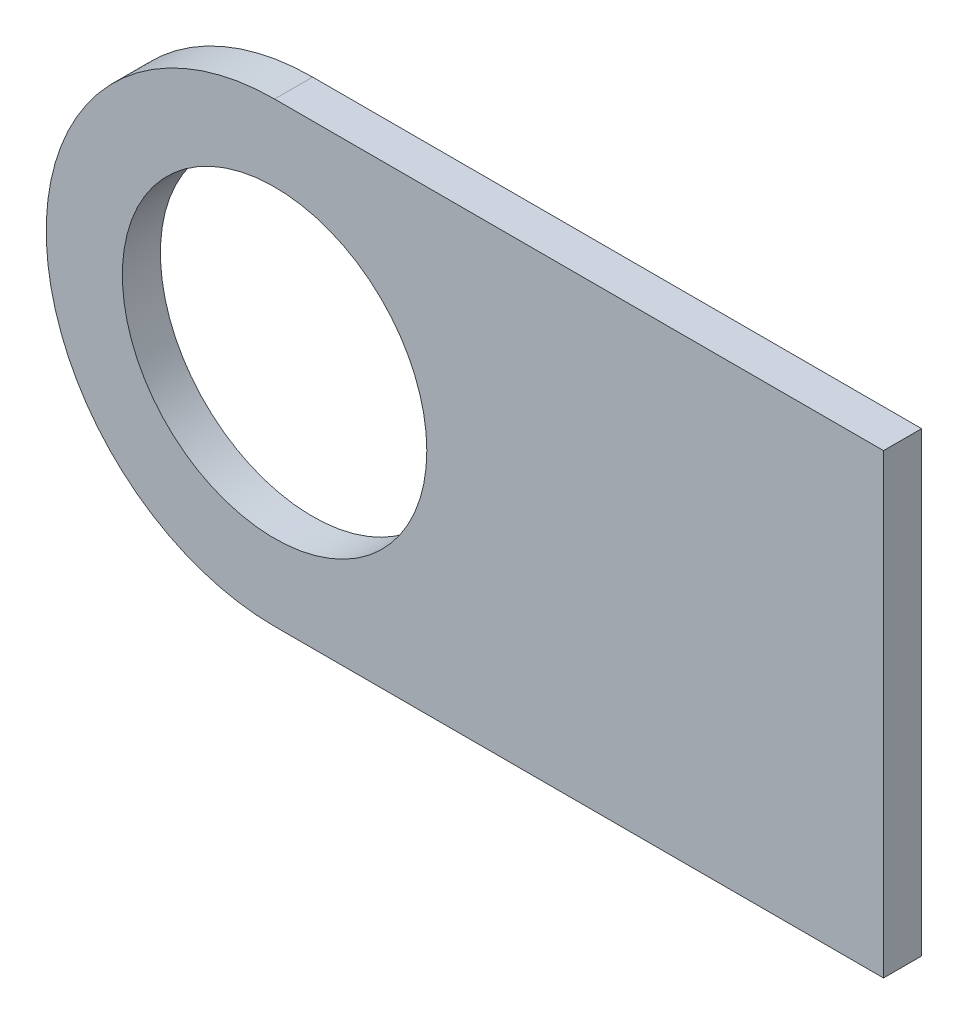
ISO-10303-21;
HEADER;
FILE_DESCRIPTION(('STEP AP214'),'2;1');
FILE_NAME('part.step','',(''),(''),'','','');
FILE_SCHEMA(('AUTOMOTIVE_DESIGN { 1 0 10303 214 1 1 1 1 }'));
ENDSEC;
DATA;
#1=APPLICATION_CONTEXT('core data for automotive mechanical design processes');
#2=APPLICATION_PROTOCOL_DEFINITION('international standard','automotive_design',2000,#1);
#3=PRODUCT_CONTEXT('',#1,'mechanical');
#4=PRODUCT('Part','Part','',(#3));
#5=PRODUCT_RELATED_PRODUCT_CATEGORY('part','',(#4));
#6=PRODUCT_DEFINITION_FORMATION('','',#4);
#7=PRODUCT_DEFINITION_CONTEXT('part definition',#1,'design');
#8=PRODUCT_DEFINITION('design','',#6,#7);
#9=PRODUCT_DEFINITION_SHAPE('','',#8);
#10=(LENGTH_UNIT() NAMED_UNIT(*) SI_UNIT(.MILLI.,.METRE.));
#11=(NAMED_UNIT(*) PLANE_ANGLE_UNIT() SI_UNIT($,.RADIAN.));
#12=(NAMED_UNIT(*) SI_UNIT($,.STERADIAN.) SOLID_ANGLE_UNIT());
#13=UNCERTAINTY_MEASURE_WITH_UNIT(LENGTH_MEASURE(1.E-05),#10,'distance_accuracy_value','');
#14=(GEOMETRIC_REPRESENTATION_CONTEXT(3) GLOBAL_UNCERTAINTY_ASSIGNED_CONTEXT((#13)) GLOBAL_UNIT_ASSIGNED_CONTEXT((#10,
#11,#12)) REPRESENTATION_CONTEXT('',''));
#15=CARTESIAN_POINT('',(0.,0.,0.));
#16=DIRECTION('',(0.,0.,1.));
#17=DIRECTION('',(1.,0.,0.));
#18=AXIS2_PLACEMENT_3D('',#15,#16,#17);
#19=CARTESIAN_POINT('',(0.,0.,3.175));
#20=DIRECTION('',(0.,0.,-1.));
#21=DIRECTION('',(-1.,0.,0.));
#22=AXIS2_PLACEMENT_3D('',#19,#20,#21);
#23=CYLINDRICAL_SURFACE('',#22,19.05);
#24=CARTESIAN_POINT('',(0.,0.,0.));
#25=DIRECTION('',(0.,0.,1.));
#26=DIRECTION('',(1.,0.,0.));
#27=AXIS2_PLACEMENT_3D('',#24,#25,#26);
#28=CIRCLE('',#27,19.05);
#29=CARTESIAN_POINT('',(0.,19.05,0.));
#30=VERTEX_POINT('',#29);
#31=CARTESIAN_POINT('',(0.,-19.05,0.));
#32=VERTEX_POINT('',#31);
#33=EDGE_CURVE('E112',#30,#32,#28,.T.);
#34=ORIENTED_EDGE('',*,*,#33,.T.);
#35=DIRECTION('',(0.,0.,-1.));
#36=VECTOR('',#35,1.);
#37=CARTESIAN_POINT('',(0.,-19.05,3.175));
#38=LINE('',#37,#36);
#39=CARTESIAN_POINT('',(0.,-19.05,3.175));
#40=VERTEX_POINT('',#39);
#41=EDGE_CURVE('E11',#40,#32,#38,.T.);
#42=ORIENTED_EDGE('',*,*,#41,.F.);
#43=CARTESIAN_POINT('',(0.,0.,3.175));
#44=DIRECTION('',(0.,0.,1.));
#45=DIRECTION('',(1.,0.,0.));
#46=AXIS2_PLACEMENT_3D('',#43,#44,#45);
#47=CIRCLE('',#46,19.05);
#48=CARTESIAN_POINT('',(0.,19.05,3.175));
#49=VERTEX_POINT('',#48);
#50=EDGE_CURVE('E95',#49,#40,#47,.T.);
#51=ORIENTED_EDGE('',*,*,#50,.F.);
#52=DIRECTION('',(0.,0.,-1.));
#53=VECTOR('',#52,1.);
#54=CARTESIAN_POINT('',(0.,19.05,3.175));
#55=LINE('',#54,#53);
#56=EDGE_CURVE('E61',#49,#30,#55,.T.);
#57=ORIENTED_EDGE('',*,*,#56,.T.);
#58=EDGE_LOOP('',(#34,#42,#51,#57));
#59=FACE_BOUND('',#58,.T.);
#60=ADVANCED_FACE('F45',(#59),#23,.T.);
#61=CARTESIAN_POINT('',(0.,-19.05,3.175));
#62=DIRECTION('',(0.,1.,0.));
#63=DIRECTION('',(0.,0.,1.));
#64=AXIS2_PLACEMENT_3D('',#61,#62,#63);
#65=PLANE('',#64);
#66=DIRECTION('',(1.,0.,0.));
#67=VECTOR('',#66,1.);
#68=CARTESIAN_POINT('',(0.,-19.05,0.));
#69=LINE('',#68,#67);
#70=CARTESIAN_POINT('',(50.8,-19.05,0.));
#71=VERTEX_POINT('',#70);
#72=EDGE_CURVE('E100',#32,#71,#69,.T.);
#73=ORIENTED_EDGE('',*,*,#72,.T.);
#74=DIRECTION('',(0.,0.,-1.));
#75=VECTOR('',#74,1.);
#76=CARTESIAN_POINT('',(50.8,-19.05,3.175));
#77=LINE('',#76,#75);
#78=CARTESIAN_POINT('',(50.8,-19.05,3.175));
#79=VERTEX_POINT('',#78);
#80=EDGE_CURVE('E53',#79,#71,#77,.T.);
#81=ORIENTED_EDGE('',*,*,#80,.F.);
#82=DIRECTION('',(1.,0.,0.));
#83=VECTOR('',#82,1.);
#84=CARTESIAN_POINT('',(0.,-19.05,3.175));
#85=LINE('',#84,#83);
#86=EDGE_CURVE('E86',#40,#79,#85,.T.);
#87=ORIENTED_EDGE('',*,*,#86,.F.);
#88=ORIENTED_EDGE('',*,*,#41,.T.);
#89=EDGE_LOOP('',(#73,#81,#87,#88));
#90=FACE_BOUND('',#89,.T.);
#91=ADVANCED_FACE('F99',(#90),#65,.F.);
#92=CARTESIAN_POINT('',(50.8,0.,3.175));
#93=DIRECTION('',(1.,0.,0.));
#94=DIRECTION('',(0.,0.,-1.));
#95=AXIS2_PLACEMENT_3D('',#92,#93,#94);
#96=PLANE('',#95);
#97=DIRECTION('',(0.,-1.,0.));
#98=VECTOR('',#97,1.);
#99=CARTESIAN_POINT('',(50.8,0.,0.));
#100=LINE('',#99,#98);
#101=CARTESIAN_POINT('',(50.8,19.05,0.));
#102=VERTEX_POINT('',#101);
#103=EDGE_CURVE('E115',#102,#71,#100,.T.);
#104=ORIENTED_EDGE('',*,*,#103,.F.);
#105=DIRECTION('',(0.,0.,-1.));
#106=VECTOR('',#105,1.);
#107=CARTESIAN_POINT('',(50.8,19.05,3.175));
#108=LINE('',#107,#106);
#109=CARTESIAN_POINT('',(50.8,19.05,3.175));
#110=VERTEX_POINT('',#109);
#111=EDGE_CURVE('E75',#110,#102,#108,.T.);
#112=ORIENTED_EDGE('',*,*,#111,.F.);
#113=DIRECTION('',(0.,-1.,0.));
#114=VECTOR('',#113,1.);
#115=CARTESIAN_POINT('',(50.8,0.,3.175));
#116=LINE('',#115,#114);
#117=EDGE_CURVE('E94',#110,#79,#116,.T.);
#118=ORIENTED_EDGE('',*,*,#117,.T.);
#119=ORIENTED_EDGE('',*,*,#80,.T.);
#120=EDGE_LOOP('',(#104,#112,#118,#119));
#121=FACE_BOUND('',#120,.T.);
#122=ADVANCED_FACE('F103',(#121),#96,.T.);
#123=CARTESIAN_POINT('',(0.,19.05,3.175));
#124=DIRECTION('',(0.,1.,0.));
#125=DIRECTION('',(0.,0.,1.));
#126=AXIS2_PLACEMENT_3D('',#123,#124,#125);
#127=PLANE('',#126);
#128=DIRECTION('',(1.,0.,0.));
#129=VECTOR('',#128,1.);
#130=CARTESIAN_POINT('',(0.,19.05,0.));
#131=LINE('',#130,#129);
#132=EDGE_CURVE('E117',#30,#102,#131,.T.);
#133=ORIENTED_EDGE('',*,*,#132,.F.);
#134=ORIENTED_EDGE('',*,*,#56,.F.);
#135=DIRECTION('',(1.,0.,0.));
#136=VECTOR('',#135,1.);
#137=CARTESIAN_POINT('',(0.,19.05,3.175));
#138=LINE('',#137,#136);
#139=EDGE_CURVE('E104',#49,#110,#138,.T.);
#140=ORIENTED_EDGE('',*,*,#139,.T.);
#141=ORIENTED_EDGE('',*,*,#111,.T.);
#142=EDGE_LOOP('',(#133,#134,#140,#141));
#143=FACE_BOUND('',#142,.T.);
#144=ADVANCED_FACE('F130',(#143),#127,.T.);
#145=CARTESIAN_POINT('',(0.,0.,3.175));
#146=DIRECTION('',(0.,0.,-1.));
#147=DIRECTION('',(-1.,0.,0.));
#148=AXIS2_PLACEMENT_3D('',#145,#146,#147);
#149=CYLINDRICAL_SURFACE('',#148,12.7);
#150=CARTESIAN_POINT('',(0.,0.,3.175));
#151=DIRECTION('',(0.,0.,1.));
#152=DIRECTION('',(1.,0.,0.));
#153=AXIS2_PLACEMENT_3D('',#150,#151,#152);
#154=CIRCLE('',#153,12.7);
#155=CARTESIAN_POINT('',(12.7,0.,3.175));
#156=VERTEX_POINT('',#155);
#157=EDGE_CURVE('E106',#156,#156,#154,.T.);
#158=ORIENTED_EDGE('',*,*,#157,.T.);
#159=EDGE_LOOP('',(#158));
#160=FACE_BOUND('',#159,.T.);
#161=CARTESIAN_POINT('',(0.,0.,0.));
#162=DIRECTION('',(0.,0.,1.));
#163=DIRECTION('',(1.,0.,0.));
#164=AXIS2_PLACEMENT_3D('',#161,#162,#163);
#165=CIRCLE('',#164,12.7);
#166=CARTESIAN_POINT('',(12.7,0.,0.));
#167=VERTEX_POINT('',#166);
#168=EDGE_CURVE('E120',#167,#167,#165,.T.);
#169=ORIENTED_EDGE('',*,*,#168,.F.);
#170=EDGE_LOOP('',(#169));
#171=FACE_BOUND('',#170,.T.);
#172=ADVANCED_FACE('F128',(#160,#171),#149,.F.);
#173=CARTESIAN_POINT('',(0.,0.,3.175));
#174=DIRECTION('',(0.,0.,1.));
#175=DIRECTION('',(1.,0.,0.));
#176=AXIS2_PLACEMENT_3D('',#173,#174,#175);
#177=PLANE('',#176);
#178=ORIENTED_EDGE('',*,*,#50,.T.);
#179=ORIENTED_EDGE('',*,*,#86,.T.);
#180=ORIENTED_EDGE('',*,*,#117,.F.);
#181=ORIENTED_EDGE('',*,*,#139,.F.);
#182=EDGE_LOOP('',(#178,#179,#180,#181));
#183=FACE_BOUND('',#182,.T.);
#184=ORIENTED_EDGE('',*,*,#157,.F.);
#185=EDGE_LOOP('',(#184));
#186=FACE_BOUND('',#185,.T.);
#187=ADVANCED_FACE('F90',(#183,#186),#177,.T.);
#188=CARTESIAN_POINT('',(0.,0.,0.));
#189=DIRECTION('',(0.,0.,1.));
#190=DIRECTION('',(1.,0.,0.));
#191=AXIS2_PLACEMENT_3D('',#188,#189,#190);
#192=PLANE('',#191);
#193=ORIENTED_EDGE('',*,*,#33,.F.);
#194=ORIENTED_EDGE('',*,*,#132,.T.);
#195=ORIENTED_EDGE('',*,*,#103,.T.);
#196=ORIENTED_EDGE('',*,*,#72,.F.);
#197=EDGE_LOOP('',(#193,#194,#195,#196));
#198=FACE_BOUND('',#197,.T.);
#199=ORIENTED_EDGE('',*,*,#168,.T.);
#200=EDGE_LOOP('',(#199));
#201=FACE_BOUND('',#200,.T.);
#202=ADVANCED_FACE('F126',(#198,#201),#192,.F.);
#203=CLOSED_SHELL('',(#60,#91,#122,#144,#172,#187,#202));
#204=MANIFOLD_SOLID_BREP('B2',#203);
#205=ADVANCED_BREP_SHAPE_REPRESENTATION('',(#18,#204),#14);
#206=SHAPE_DEFINITION_REPRESENTATION(#9,#205);
ENDSEC;
END-ISO-10303-21;
